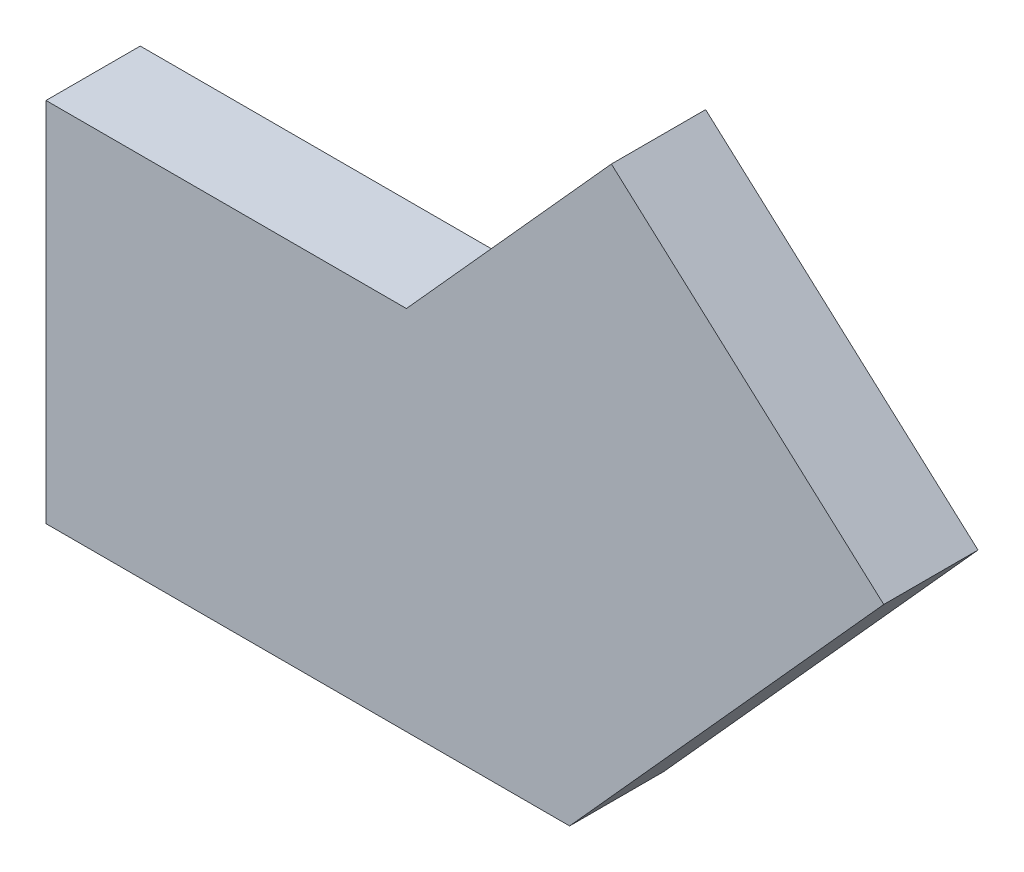
ISO-10303-21;
HEADER;
FILE_DESCRIPTION(('STEP AP214'),'2;1');
FILE_NAME('part.step','',(''),(''),'','','');
FILE_SCHEMA(('AUTOMOTIVE_DESIGN { 1 0 10303 214 1 1 1 1 }'));
ENDSEC;
DATA;
#1=APPLICATION_CONTEXT('core data for automotive mechanical design processes');
#2=APPLICATION_PROTOCOL_DEFINITION('international standard','automotive_design',2000,#1);
#3=PRODUCT_CONTEXT('',#1,'mechanical');
#4=PRODUCT('Part','Part','',(#3));
#5=PRODUCT_RELATED_PRODUCT_CATEGORY('part','',(#4));
#6=PRODUCT_DEFINITION_FORMATION('','',#4);
#7=PRODUCT_DEFINITION_CONTEXT('part definition',#1,'design');
#8=PRODUCT_DEFINITION('design','',#6,#7);
#9=PRODUCT_DEFINITION_SHAPE('','',#8);
#10=(LENGTH_UNIT() NAMED_UNIT(*) SI_UNIT(.MILLI.,.METRE.));
#11=(NAMED_UNIT(*) PLANE_ANGLE_UNIT() SI_UNIT($,.RADIAN.));
#12=(NAMED_UNIT(*) SI_UNIT($,.STERADIAN.) SOLID_ANGLE_UNIT());
#13=UNCERTAINTY_MEASURE_WITH_UNIT(LENGTH_MEASURE(1.E-05),#10,'distance_accuracy_value','');
#14=(GEOMETRIC_REPRESENTATION_CONTEXT(3) GLOBAL_UNCERTAINTY_ASSIGNED_CONTEXT((#13)) GLOBAL_UNIT_ASSIGNED_CONTEXT((#10,
#11,#12)) REPRESENTATION_CONTEXT('',''));
#15=CARTESIAN_POINT('',(0.,0.,0.));
#16=DIRECTION('',(0.,0.,1.));
#17=DIRECTION('',(1.,0.,0.));
#18=AXIS2_PLACEMENT_3D('',#15,#16,#17);
#19=CARTESIAN_POINT('',(53.9899311082911,56.7379466674359,8.99999999999999));
#20=DIRECTION('',(0.743144825477396,-0.669130606358856,0.));
#21=DIRECTION('',(0.669130606358856,0.743144825477396,0.));
#22=AXIS2_PLACEMENT_3D('',#19,#20,#21);
#23=PLANE('',#22);
#24=DIRECTION('',(-0.669130606358856,-0.743144825477396,0.));
#25=VECTOR('',#24,1.);
#26=CARTESIAN_POINT('',(53.9899311082911,56.7379466674359,0.));
#27=LINE('',#26,#25);
#28=CARTESIAN_POINT('',(53.9899311082911,56.7379466674359,0.));
#29=VERTEX_POINT('',#28);
#30=CARTESIAN_POINT('',(34.4169960142012,35.,0.));
#31=VERTEX_POINT('',#30);
#32=EDGE_CURVE('E128',#29,#31,#27,.T.);
#33=ORIENTED_EDGE('',*,*,#32,.T.);
#34=DIRECTION('',(0.,0.,-1.));
#35=VECTOR('',#34,1.);
#36=CARTESIAN_POINT('',(34.4169960142012,35.,8.99999999999999));
#37=LINE('',#36,#35);
#38=CARTESIAN_POINT('',(34.4169960142012,35.,8.99999999999999));
#39=VERTEX_POINT('',#38);
#40=EDGE_CURVE('E11',#39,#31,#37,.T.);
#41=ORIENTED_EDGE('',*,*,#40,.F.);
#42=DIRECTION('',(-0.669130606358856,-0.743144825477396,0.));
#43=VECTOR('',#42,1.);
#44=CARTESIAN_POINT('',(53.9899311082911,56.7379466674359,8.99999999999999));
#45=LINE('',#44,#43);
#46=CARTESIAN_POINT('',(53.9899311082911,56.7379466674359,8.99999999999999));
#47=VERTEX_POINT('',#46);
#48=EDGE_CURVE('E144',#47,#39,#45,.T.);
#49=ORIENTED_EDGE('',*,*,#48,.F.);
#50=DIRECTION('',(0.,0.,-1.));
#51=VECTOR('',#50,1.);
#52=CARTESIAN_POINT('',(53.9899311082911,56.7379466674359,8.99999999999999));
#53=LINE('',#52,#51);
#54=EDGE_CURVE('E124',#47,#29,#53,.T.);
#55=ORIENTED_EDGE('',*,*,#54,.T.);
#56=EDGE_LOOP('',(#33,#41,#49,#55));
#57=FACE_BOUND('',#56,.T.);
#58=ADVANCED_FACE('F39',(#57),#23,.F.);
#59=CARTESIAN_POINT('',(34.4169960142012,35.,8.99999999999999));
#60=DIRECTION('',(0.,-1.,0.));
#61=DIRECTION('',(1.,0.,0.));
#62=AXIS2_PLACEMENT_3D('',#59,#60,#61);
#63=PLANE('',#62);
#64=DIRECTION('',(-1.,0.,0.));
#65=VECTOR('',#64,1.);
#66=CARTESIAN_POINT('',(34.4169960142012,35.,0.));
#67=LINE('',#66,#65);
#68=CARTESIAN_POINT('',(0.,35.,0.));
#69=VERTEX_POINT('',#68);
#70=EDGE_CURVE('E132',#31,#69,#67,.T.);
#71=ORIENTED_EDGE('',*,*,#70,.T.);
#72=DIRECTION('',(0.,0.,-1.));
#73=VECTOR('',#72,1.);
#74=CARTESIAN_POINT('',(0.,35.,8.99999999999999));
#75=LINE('',#74,#73);
#76=CARTESIAN_POINT('',(0.,35.,8.99999999999999));
#77=VERTEX_POINT('',#76);
#78=EDGE_CURVE('E48',#77,#69,#75,.T.);
#79=ORIENTED_EDGE('',*,*,#78,.F.);
#80=DIRECTION('',(-1.,0.,0.));
#81=VECTOR('',#80,1.);
#82=CARTESIAN_POINT('',(34.4169960142012,35.,8.99999999999999));
#83=LINE('',#82,#81);
#84=EDGE_CURVE('E93',#39,#77,#83,.T.);
#85=ORIENTED_EDGE('',*,*,#84,.F.);
#86=ORIENTED_EDGE('',*,*,#40,.T.);
#87=EDGE_LOOP('',(#71,#79,#85,#86));
#88=FACE_BOUND('',#87,.T.);
#89=ADVANCED_FACE('F172',(#88),#63,.F.);
#90=CARTESIAN_POINT('',(0.,35.,8.99999999999999));
#91=DIRECTION('',(1.,0.,0.));
#92=DIRECTION('',(0.,1.,0.));
#93=AXIS2_PLACEMENT_3D('',#90,#91,#92);
#94=PLANE('',#93);
#95=DIRECTION('',(0.,-1.,0.));
#96=VECTOR('',#95,1.);
#97=CARTESIAN_POINT('',(0.,35.,0.));
#98=LINE('',#97,#96);
#99=CARTESIAN_POINT('',(0.,0.,0.));
#100=VERTEX_POINT('',#99);
#101=EDGE_CURVE('E135',#69,#100,#98,.T.);
#102=ORIENTED_EDGE('',*,*,#101,.T.);
#103=DIRECTION('',(0.,0.,-1.));
#104=VECTOR('',#103,1.);
#105=CARTESIAN_POINT('',(0.,0.,8.99999999999999));
#106=LINE('',#105,#104);
#107=CARTESIAN_POINT('',(0.,0.,8.99999999999999));
#108=VERTEX_POINT('',#107);
#109=EDGE_CURVE('E117',#108,#100,#106,.T.);
#110=ORIENTED_EDGE('',*,*,#109,.F.);
#111=DIRECTION('',(0.,-1.,0.));
#112=VECTOR('',#111,1.);
#113=CARTESIAN_POINT('',(0.,35.,8.99999999999999));
#114=LINE('',#113,#112);
#115=EDGE_CURVE('E106',#77,#108,#114,.T.);
#116=ORIENTED_EDGE('',*,*,#115,.F.);
#117=ORIENTED_EDGE('',*,*,#78,.T.);
#118=EDGE_LOOP('',(#102,#110,#116,#117));
#119=FACE_BOUND('',#118,.T.);
#120=ADVANCED_FACE('F154',(#119),#94,.F.);
#121=CARTESIAN_POINT('',(0.,0.,8.99999999999999));
#122=DIRECTION('',(0.,1.,0.));
#123=DIRECTION('',(0.,0.,1.));
#124=AXIS2_PLACEMENT_3D('',#121,#122,#123);
#125=PLANE('',#124);
#126=DIRECTION('',(1.,0.,0.));
#127=VECTOR('',#126,1.);
#128=CARTESIAN_POINT('',(0.,0.,0.));
#129=LINE('',#128,#127);
#130=CARTESIAN_POINT('',(50.,0.,0.));
#131=VERTEX_POINT('',#130);
#132=EDGE_CURVE('E115',#100,#131,#129,.T.);
#133=ORIENTED_EDGE('',*,*,#132,.T.);
#134=DIRECTION('',(0.,0.,-1.));
#135=VECTOR('',#134,1.);
#136=CARTESIAN_POINT('',(50.,0.,8.99999999999999));
#137=LINE('',#136,#135);
#138=CARTESIAN_POINT('',(50.,0.,8.99999999999999));
#139=VERTEX_POINT('',#138);
#140=EDGE_CURVE('E112',#139,#131,#137,.T.);
#141=ORIENTED_EDGE('',*,*,#140,.F.);
#142=DIRECTION('',(1.,0.,0.));
#143=VECTOR('',#142,1.);
#144=CARTESIAN_POINT('',(0.,0.,8.99999999999999));
#145=LINE('',#144,#143);
#146=EDGE_CURVE('E100',#108,#139,#145,.T.);
#147=ORIENTED_EDGE('',*,*,#146,.F.);
#148=ORIENTED_EDGE('',*,*,#109,.T.);
#149=EDGE_LOOP('',(#133,#141,#147,#148));
#150=FACE_BOUND('',#149,.T.);
#151=ADVANCED_FACE('F113',(#150),#125,.F.);
#152=CARTESIAN_POINT('',(50.,0.,8.99999999999999));
#153=DIRECTION('',(-0.743144825477396,0.669130606358857,0.));
#154=DIRECTION('',(-0.669130606358857,-0.743144825477396,0.));
#155=AXIS2_PLACEMENT_3D('',#152,#153,#154);
#156=PLANE('',#155);
#157=DIRECTION('',(0.669130606358856,0.743144825477396,0.));
#158=VECTOR('',#157,1.);
#159=CARTESIAN_POINT('',(50.,0.,0.));
#160=LINE('',#159,#158);
#161=CARTESIAN_POINT('',(80.,33.3183754448759,0.));
#162=VERTEX_POINT('',#161);
#163=EDGE_CURVE('E79',#131,#162,#160,.T.);
#164=ORIENTED_EDGE('',*,*,#163,.T.);
#165=DIRECTION('',(0.,0.,-1.));
#166=VECTOR('',#165,1.);
#167=CARTESIAN_POINT('',(80.,33.3183754448759,8.99999999999999));
#168=LINE('',#167,#166);
#169=CARTESIAN_POINT('',(80.,33.3183754448759,8.99999999999999));
#170=VERTEX_POINT('',#169);
#171=EDGE_CURVE('E118',#170,#162,#168,.T.);
#172=ORIENTED_EDGE('',*,*,#171,.F.);
#173=DIRECTION('',(0.669130606358856,0.743144825477396,0.));
#174=VECTOR('',#173,1.);
#175=CARTESIAN_POINT('',(50.,0.,8.99999999999999));
#176=LINE('',#175,#174);
#177=EDGE_CURVE('E104',#139,#170,#176,.T.);
#178=ORIENTED_EDGE('',*,*,#177,.F.);
#179=ORIENTED_EDGE('',*,*,#140,.T.);
#180=EDGE_LOOP('',(#164,#172,#178,#179));
#181=FACE_BOUND('',#180,.T.);
#182=ADVANCED_FACE('F120',(#181),#156,.F.);
#183=CARTESIAN_POINT('',(80.,33.3183754448759,8.99999999999999));
#184=DIRECTION('',(-0.669130606358856,-0.743144825477396,0.));
#185=DIRECTION('',(0.743144825477396,-0.669130606358856,0.));
#186=AXIS2_PLACEMENT_3D('',#183,#184,#185);
#187=PLANE('',#186);
#188=DIRECTION('',(-0.743144825477396,0.669130606358856,0.));
#189=VECTOR('',#188,1.);
#190=CARTESIAN_POINT('',(80.,33.3183754448759,0.));
#191=LINE('',#190,#189);
#192=EDGE_CURVE('E85',#162,#29,#191,.T.);
#193=ORIENTED_EDGE('',*,*,#192,.T.);
#194=ORIENTED_EDGE('',*,*,#54,.F.);
#195=DIRECTION('',(-0.743144825477396,0.669130606358856,0.));
#196=VECTOR('',#195,1.);
#197=CARTESIAN_POINT('',(80.,33.3183754448759,8.99999999999999));
#198=LINE('',#197,#196);
#199=EDGE_CURVE('E56',#170,#47,#198,.T.);
#200=ORIENTED_EDGE('',*,*,#199,.F.);
#201=ORIENTED_EDGE('',*,*,#171,.T.);
#202=EDGE_LOOP('',(#193,#194,#200,#201));
#203=FACE_BOUND('',#202,.T.);
#204=ADVANCED_FACE('F161',(#203),#187,.F.);
#205=CARTESIAN_POINT('',(0.,0.,8.99999999999999));
#206=DIRECTION('',(0.,0.,-1.));
#207=DIRECTION('',(-1.,0.,0.));
#208=AXIS2_PLACEMENT_3D('',#205,#206,#207);
#209=PLANE('',#208);
#210=ORIENTED_EDGE('',*,*,#48,.T.);
#211=ORIENTED_EDGE('',*,*,#84,.T.);
#212=ORIENTED_EDGE('',*,*,#115,.T.);
#213=ORIENTED_EDGE('',*,*,#146,.T.);
#214=ORIENTED_EDGE('',*,*,#177,.T.);
#215=ORIENTED_EDGE('',*,*,#199,.T.);
#216=EDGE_LOOP('',(#210,#211,#212,#213,#214,#215));
#217=FACE_BOUND('',#216,.T.);
#218=ADVANCED_FACE('F102',(#217),#209,.F.);
#219=CARTESIAN_POINT('',(0.,0.,0.));
#220=DIRECTION('',(0.,0.,-1.));
#221=DIRECTION('',(-1.,0.,0.));
#222=AXIS2_PLACEMENT_3D('',#219,#220,#221);
#223=PLANE('',#222);
#224=ORIENTED_EDGE('',*,*,#32,.F.);
#225=ORIENTED_EDGE('',*,*,#192,.F.);
#226=ORIENTED_EDGE('',*,*,#163,.F.);
#227=ORIENTED_EDGE('',*,*,#132,.F.);
#228=ORIENTED_EDGE('',*,*,#101,.F.);
#229=ORIENTED_EDGE('',*,*,#70,.F.);
#230=EDGE_LOOP('',(#224,#225,#226,#227,#228,#229));
#231=FACE_BOUND('',#230,.T.);
#232=ADVANCED_FACE('F157',(#231),#223,.T.);
#233=CLOSED_SHELL('',(#58,#89,#120,#151,#182,#204,#218,#232));
#234=MANIFOLD_SOLID_BREP('B2',#233);
#235=ADVANCED_BREP_SHAPE_REPRESENTATION('',(#18,#234),#14);
#236=SHAPE_DEFINITION_REPRESENTATION(#9,#235);
ENDSEC;
END-ISO-10303-21;
